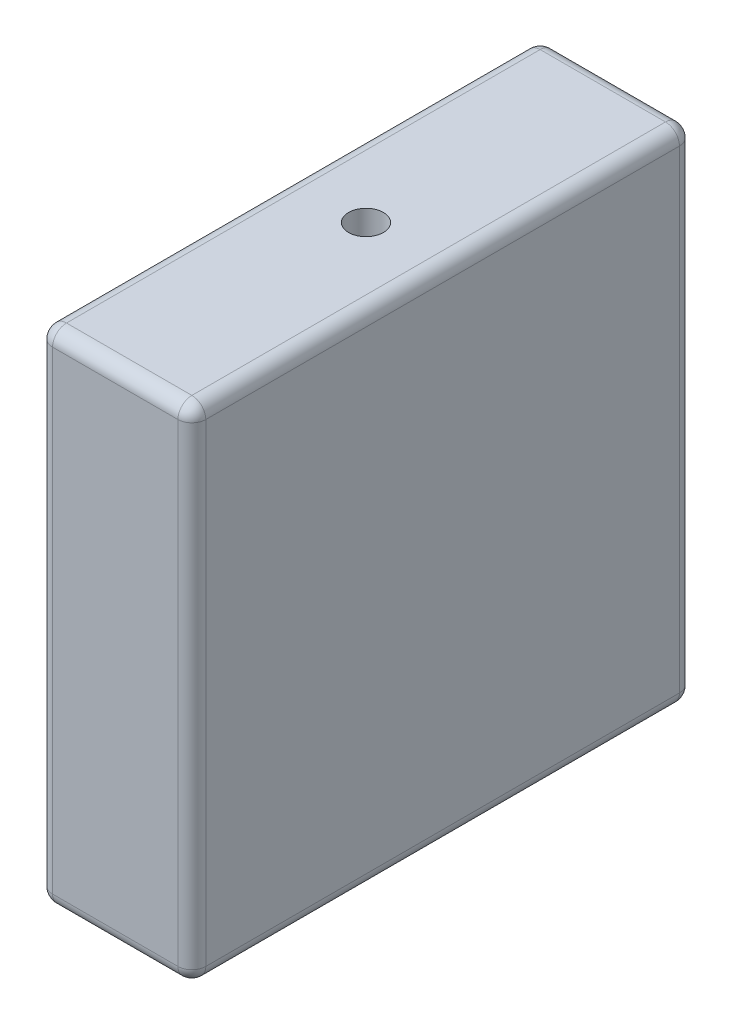
ISO-10303-21;
HEADER;
FILE_DESCRIPTION(('STEP AP214'),'2;1');
FILE_NAME('part.step','',(''),(''),'','','');
FILE_SCHEMA(('AUTOMOTIVE_DESIGN { 1 0 10303 214 1 1 1 1 }'));
ENDSEC;
DATA;
#1=APPLICATION_CONTEXT('core data for automotive mechanical design processes');
#2=APPLICATION_PROTOCOL_DEFINITION('international standard','automotive_design',2000,#1);
#3=PRODUCT_CONTEXT('',#1,'mechanical');
#4=PRODUCT('Part','Part','',(#3));
#5=PRODUCT_RELATED_PRODUCT_CATEGORY('part','',(#4));
#6=PRODUCT_DEFINITION_FORMATION('','',#4);
#7=PRODUCT_DEFINITION_CONTEXT('part definition',#1,'design');
#8=PRODUCT_DEFINITION('design','',#6,#7);
#9=PRODUCT_DEFINITION_SHAPE('','',#8);
#10=(LENGTH_UNIT() NAMED_UNIT(*) SI_UNIT(.MILLI.,.METRE.));
#11=(NAMED_UNIT(*) PLANE_ANGLE_UNIT() SI_UNIT($,.RADIAN.));
#12=(NAMED_UNIT(*) SI_UNIT($,.STERADIAN.) SOLID_ANGLE_UNIT());
#13=UNCERTAINTY_MEASURE_WITH_UNIT(LENGTH_MEASURE(1.E-05),#10,'distance_accuracy_value','');
#14=(GEOMETRIC_REPRESENTATION_CONTEXT(3) GLOBAL_UNCERTAINTY_ASSIGNED_CONTEXT((#13)) GLOBAL_UNIT_ASSIGNED_CONTEXT((#10,
#11,#12)) REPRESENTATION_CONTEXT('',''));
#15=CARTESIAN_POINT('',(0.,0.,0.));
#16=DIRECTION('',(0.,0.,1.));
#17=DIRECTION('',(1.,0.,0.));
#18=AXIS2_PLACEMENT_3D('',#15,#16,#17);
#19=CARTESIAN_POINT('',(11.,27.3964350537823,30.7352782576782));
#20=DIRECTION('',(0.,0.,-1.));
#21=DIRECTION('',(-1.,0.,0.));
#22=AXIS2_PLACEMENT_3D('',#19,#20,#21);
#23=PLANE('',#22);
#24=DIRECTION('',(-1.,0.,0.));
#25=VECTOR('',#24,1.);
#26=CARTESIAN_POINT('',(11.,26.3964350537823,30.7352782576782));
#27=LINE('',#26,#25);
#28=CARTESIAN_POINT('',(10.,26.3964350537823,30.7352782576782));
#29=VERTEX_POINT('',#28);
#30=CARTESIAN_POINT('',(1.,26.3964350537823,30.7352782576782));
#31=VERTEX_POINT('',#30);
#32=EDGE_CURVE('E224',#29,#31,#27,.T.);
#33=ORIENTED_EDGE('',*,*,#32,.T.);
#34=DIRECTION('',(0.,-1.,0.));
#35=VECTOR('',#34,1.);
#36=CARTESIAN_POINT('',(1.,27.3964350537823,30.7352782576782));
#37=LINE('',#36,#35);
#38=CARTESIAN_POINT('',(1.,-7.60356494621773,30.7352782576782));
#39=VERTEX_POINT('',#38);
#40=EDGE_CURVE('E228',#31,#39,#37,.T.);
#41=ORIENTED_EDGE('',*,*,#40,.T.);
#42=DIRECTION('',(-1.,0.,0.));
#43=VECTOR('',#42,1.);
#44=CARTESIAN_POINT('',(11.,-7.60356494621773,30.7352782576782));
#45=LINE('',#44,#43);
#46=CARTESIAN_POINT('',(10.,-7.60356494621773,30.7352782576782));
#47=VERTEX_POINT('',#46);
#48=EDGE_CURVE('E221',#39,#47,#45,.F.);
#49=ORIENTED_EDGE('',*,*,#48,.T.);
#50=DIRECTION('',(0.,-1.,0.));
#51=VECTOR('',#50,1.);
#52=CARTESIAN_POINT('',(10.,27.3964350537823,30.7352782576782));
#53=LINE('',#52,#51);
#54=EDGE_CURVE('E218',#47,#29,#53,.F.);
#55=ORIENTED_EDGE('',*,*,#54,.T.);
#56=EDGE_LOOP('',(#33,#41,#49,#55));
#57=FACE_BOUND('',#56,.T.);
#58=ADVANCED_FACE('F39',(#57),#23,.F.);
#59=CARTESIAN_POINT('',(11.,-8.60356494621773,30.7352782576782));
#60=DIRECTION('',(0.,1.,0.));
#61=DIRECTION('',(0.,0.,1.));
#62=AXIS2_PLACEMENT_3D('',#59,#60,#61);
#63=PLANE('',#62);
#64=CARTESIAN_POINT('',(5.5,-8.60356494621773,12.7352782576782));
#65=DIRECTION('',(0.,-1.,0.));
#66=DIRECTION('',(0.,0.,-1.));
#67=AXIS2_PLACEMENT_3D('',#64,#65,#66);
#68=CIRCLE('',#67,1.25);
#69=CARTESIAN_POINT('',(5.5,-8.60356494621773,11.4852782576782));
#70=VERTEX_POINT('',#69);
#71=EDGE_CURVE('E445',#70,#70,#68,.T.);
#72=ORIENTED_EDGE('',*,*,#71,.F.);
#73=EDGE_LOOP('',(#72));
#74=FACE_BOUND('',#73,.T.);
#75=DIRECTION('',(0.,0.,-1.));
#76=VECTOR('',#75,1.);
#77=CARTESIAN_POINT('',(1.,-8.60356494621773,30.7352782576782));
#78=LINE('',#77,#76);
#79=CARTESIAN_POINT('',(1.,-8.60356494621773,29.7352782576782));
#80=VERTEX_POINT('',#79);
#81=CARTESIAN_POINT('',(1.,-8.60356494621773,-4.26472174232184));
#82=VERTEX_POINT('',#81);
#83=EDGE_CURVE('E187',#80,#82,#78,.T.);
#84=ORIENTED_EDGE('',*,*,#83,.T.);
#85=DIRECTION('',(-1.,0.,0.));
#86=VECTOR('',#85,1.);
#87=CARTESIAN_POINT('',(11.,-8.60356494621773,-4.26472174232183));
#88=LINE('',#87,#86);
#89=CARTESIAN_POINT('',(10.,-8.60356494621773,-4.26472174232184));
#90=VERTEX_POINT('',#89);
#91=EDGE_CURVE('E190',#82,#90,#88,.F.);
#92=ORIENTED_EDGE('',*,*,#91,.T.);
#93=DIRECTION('',(0.,0.,-1.));
#94=VECTOR('',#93,1.);
#95=CARTESIAN_POINT('',(10.,-8.60356494621773,30.7352782576782));
#96=LINE('',#95,#94);
#97=CARTESIAN_POINT('',(10.,-8.60356494621773,29.7352782576782));
#98=VERTEX_POINT('',#97);
#99=EDGE_CURVE('E181',#90,#98,#96,.F.);
#100=ORIENTED_EDGE('',*,*,#99,.T.);
#101=DIRECTION('',(-1.,0.,0.));
#102=VECTOR('',#101,1.);
#103=CARTESIAN_POINT('',(11.,-8.60356494621773,29.7352782576782));
#104=LINE('',#103,#102);
#105=EDGE_CURVE('E184',#98,#80,#104,.T.);
#106=ORIENTED_EDGE('',*,*,#105,.T.);
#107=EDGE_LOOP('',(#84,#92,#100,#106));
#108=FACE_BOUND('',#107,.T.);
#109=ADVANCED_FACE('F363',(#74,#108),#63,.F.);
#110=CARTESIAN_POINT('',(11.,27.3964350537823,-5.26472174232184));
#111=DIRECTION('',(0.,0.,1.));
#112=DIRECTION('',(1.,0.,0.));
#113=AXIS2_PLACEMENT_3D('',#110,#111,#112);
#114=PLANE('',#113);
#115=DIRECTION('',(-1.,0.,0.));
#116=VECTOR('',#115,1.);
#117=CARTESIAN_POINT('',(11.,-7.60356494621773,-5.26472174232184));
#118=LINE('',#117,#116);
#119=CARTESIAN_POINT('',(10.,-7.60356494621773,-5.26472174232184));
#120=VERTEX_POINT('',#119);
#121=CARTESIAN_POINT('',(1.,-7.60356494621773,-5.26472174232184));
#122=VERTEX_POINT('',#121);
#123=EDGE_CURVE('E140',#120,#122,#118,.T.);
#124=ORIENTED_EDGE('',*,*,#123,.T.);
#125=DIRECTION('',(0.,1.,0.));
#126=VECTOR('',#125,1.);
#127=CARTESIAN_POINT('',(1.,27.3964350537823,-5.26472174232184));
#128=LINE('',#127,#126);
#129=CARTESIAN_POINT('',(1.,26.3964350537823,-5.26472174232184));
#130=VERTEX_POINT('',#129);
#131=EDGE_CURVE('E135',#122,#130,#128,.T.);
#132=ORIENTED_EDGE('',*,*,#131,.T.);
#133=DIRECTION('',(-1.,0.,0.));
#134=VECTOR('',#133,1.);
#135=CARTESIAN_POINT('',(11.,26.3964350537823,-5.26472174232184));
#136=LINE('',#135,#134);
#137=CARTESIAN_POINT('',(10.,26.3964350537823,-5.26472174232184));
#138=VERTEX_POINT('',#137);
#139=EDGE_CURVE('E127',#130,#138,#136,.F.);
#140=ORIENTED_EDGE('',*,*,#139,.T.);
#141=DIRECTION('',(0.,1.,0.));
#142=VECTOR('',#141,1.);
#143=CARTESIAN_POINT('',(10.,-8.60356494621773,-5.26472174232184));
#144=LINE('',#143,#142);
#145=EDGE_CURVE('E132',#138,#120,#144,.F.);
#146=ORIENTED_EDGE('',*,*,#145,.T.);
#147=EDGE_LOOP('',(#124,#132,#140,#146));
#148=FACE_BOUND('',#147,.T.);
#149=ADVANCED_FACE('F130',(#148),#114,.F.);
#150=CARTESIAN_POINT('',(11.,27.3964350537823,30.7352782576782));
#151=DIRECTION('',(0.,-1.,0.));
#152=DIRECTION('',(0.,0.,-1.));
#153=AXIS2_PLACEMENT_3D('',#150,#151,#152);
#154=PLANE('',#153);
#155=CARTESIAN_POINT('',(5.5,27.3964350537823,12.7352782576782));
#156=DIRECTION('',(0.,-1.,0.));
#157=DIRECTION('',(0.,0.,-1.));
#158=AXIS2_PLACEMENT_3D('',#155,#156,#157);
#159=CIRCLE('',#158,1.25);
#160=CARTESIAN_POINT('',(5.5,27.3964350537823,11.4852782576782));
#161=VERTEX_POINT('',#160);
#162=EDGE_CURVE('E174',#161,#161,#159,.F.);
#163=ORIENTED_EDGE('',*,*,#162,.F.);
#164=EDGE_LOOP('',(#163));
#165=FACE_BOUND('',#164,.T.);
#166=DIRECTION('',(0.,0.,1.));
#167=VECTOR('',#166,1.);
#168=CARTESIAN_POINT('',(10.,27.3964350537823,-5.26472174232184));
#169=LINE('',#168,#167);
#170=CARTESIAN_POINT('',(10.,27.3964350537823,29.7352782576782));
#171=VERTEX_POINT('',#170);
#172=CARTESIAN_POINT('',(10.,27.3964350537823,-4.26472174232183));
#173=VERTEX_POINT('',#172);
#174=EDGE_CURVE('E194',#171,#173,#169,.F.);
#175=ORIENTED_EDGE('',*,*,#174,.T.);
#176=DIRECTION('',(-1.,0.,0.));
#177=VECTOR('',#176,1.);
#178=CARTESIAN_POINT('',(11.,27.3964350537823,-4.26472174232183));
#179=LINE('',#178,#177);
#180=CARTESIAN_POINT('',(1.,27.3964350537823,-4.26472174232183));
#181=VERTEX_POINT('',#180);
#182=EDGE_CURVE('E148',#173,#181,#179,.T.);
#183=ORIENTED_EDGE('',*,*,#182,.T.);
#184=DIRECTION('',(0.,0.,1.));
#185=VECTOR('',#184,1.);
#186=CARTESIAN_POINT('',(1.,27.3964350537823,30.7352782576782));
#187=LINE('',#186,#185);
#188=CARTESIAN_POINT('',(1.,27.3964350537823,29.7352782576782));
#189=VERTEX_POINT('',#188);
#190=EDGE_CURVE('E200',#181,#189,#187,.T.);
#191=ORIENTED_EDGE('',*,*,#190,.T.);
#192=DIRECTION('',(-1.,0.,0.));
#193=VECTOR('',#192,1.);
#194=CARTESIAN_POINT('',(11.,27.3964350537823,29.7352782576782));
#195=LINE('',#194,#193);
#196=EDGE_CURVE('E197',#189,#171,#195,.F.);
#197=ORIENTED_EDGE('',*,*,#196,.T.);
#198=EDGE_LOOP('',(#175,#183,#191,#197));
#199=FACE_BOUND('',#198,.T.);
#200=ADVANCED_FACE('F353',(#165,#199),#154,.F.);
#201=CARTESIAN_POINT('',(11.,0.,0.));
#202=DIRECTION('',(1.,0.,0.));
#203=DIRECTION('',(0.,0.,-1.));
#204=AXIS2_PLACEMENT_3D('',#201,#202,#203);
#205=PLANE('',#204);
#206=DIRECTION('',(0.,1.,0.));
#207=VECTOR('',#206,1.);
#208=CARTESIAN_POINT('',(11.,27.3964350537823,-4.26472174232184));
#209=LINE('',#208,#207);
#210=CARTESIAN_POINT('',(11.,-7.60356494621773,-4.26472174232184));
#211=VERTEX_POINT('',#210);
#212=CARTESIAN_POINT('',(11.,26.3964350537823,-4.26472174232184));
#213=VERTEX_POINT('',#212);
#214=EDGE_CURVE('E49',#211,#213,#209,.T.);
#215=ORIENTED_EDGE('',*,*,#214,.T.);
#216=DIRECTION('',(0.,0.,1.));
#217=VECTOR('',#216,1.);
#218=CARTESIAN_POINT('',(11.,26.3964350537823,30.7352782576782));
#219=LINE('',#218,#217);
#220=CARTESIAN_POINT('',(11.,26.3964350537823,29.7352782576782));
#221=VERTEX_POINT('',#220);
#222=EDGE_CURVE('E11',#213,#221,#219,.T.);
#223=ORIENTED_EDGE('',*,*,#222,.T.);
#224=DIRECTION('',(0.,-1.,0.));
#225=VECTOR('',#224,1.);
#226=CARTESIAN_POINT('',(11.,-8.60356494621773,29.7352782576782));
#227=LINE('',#226,#225);
#228=CARTESIAN_POINT('',(11.,-7.60356494621773,29.7352782576782));
#229=VERTEX_POINT('',#228);
#230=EDGE_CURVE('E231',#221,#229,#227,.T.);
#231=ORIENTED_EDGE('',*,*,#230,.T.);
#232=DIRECTION('',(0.,0.,-1.));
#233=VECTOR('',#232,1.);
#234=CARTESIAN_POINT('',(11.,-7.60356494621773,-5.26472174232184));
#235=LINE('',#234,#233);
#236=EDGE_CURVE('E60',#229,#211,#235,.T.);
#237=ORIENTED_EDGE('',*,*,#236,.T.);
#238=EDGE_LOOP('',(#215,#223,#231,#237));
#239=FACE_BOUND('',#238,.T.);
#240=ADVANCED_FACE('F355',(#239),#205,.T.);
#241=CARTESIAN_POINT('',(0.,0.,0.));
#242=DIRECTION('',(1.,0.,0.));
#243=DIRECTION('',(0.,0.,-1.));
#244=AXIS2_PLACEMENT_3D('',#241,#242,#243);
#245=PLANE('',#244);
#246=DIRECTION('',(0.,1.,0.));
#247=VECTOR('',#246,1.);
#248=CARTESIAN_POINT('',(0.,0.,-4.26472174232184));
#249=LINE('',#248,#247);
#250=CARTESIAN_POINT('',(0.,26.3964350537823,-4.26472174232184));
#251=VERTEX_POINT('',#250);
#252=CARTESIAN_POINT('',(0.,-7.60356494621773,-4.26472174232184));
#253=VERTEX_POINT('',#252);
#254=EDGE_CURVE('E211',#251,#253,#249,.F.);
#255=ORIENTED_EDGE('',*,*,#254,.T.);
#256=DIRECTION('',(0.,0.,-1.));
#257=VECTOR('',#256,1.);
#258=CARTESIAN_POINT('',(0.,-7.60356494621773,0.));
#259=LINE('',#258,#257);
#260=CARTESIAN_POINT('',(0.,-7.60356494621773,29.7352782576782));
#261=VERTEX_POINT('',#260);
#262=EDGE_CURVE('E214',#253,#261,#259,.F.);
#263=ORIENTED_EDGE('',*,*,#262,.T.);
#264=DIRECTION('',(0.,-1.,0.));
#265=VECTOR('',#264,1.);
#266=CARTESIAN_POINT('',(0.,0.,29.7352782576782));
#267=LINE('',#266,#265);
#268=CARTESIAN_POINT('',(0.,26.3964350537823,29.7352782576782));
#269=VERTEX_POINT('',#268);
#270=EDGE_CURVE('E205',#261,#269,#267,.F.);
#271=ORIENTED_EDGE('',*,*,#270,.T.);
#272=DIRECTION('',(0.,0.,1.));
#273=VECTOR('',#272,1.);
#274=CARTESIAN_POINT('',(0.,26.3964350537823,0.));
#275=LINE('',#274,#273);
#276=EDGE_CURVE('E208',#269,#251,#275,.F.);
#277=ORIENTED_EDGE('',*,*,#276,.T.);
#278=EDGE_LOOP('',(#255,#263,#271,#277));
#279=FACE_BOUND('',#278,.T.);
#280=ADVANCED_FACE('F322',(#279),#245,.F.);
#281=CARTESIAN_POINT('',(11.,26.3964350537823,29.7352782576782));
#282=DIRECTION('',(-1.,0.,0.));
#283=DIRECTION('',(0.,0.,1.));
#284=AXIS2_PLACEMENT_3D('',#281,#282,#283);
#285=CYLINDRICAL_SURFACE('',#284,1.);
#286=CARTESIAN_POINT('',(10.,26.3964350537823,29.7352782576782));
#287=DIRECTION('',(1.,0.,0.));
#288=DIRECTION('',(0.,0.,-1.));
#289=AXIS2_PLACEMENT_3D('',#286,#287,#288);
#290=CIRCLE('',#289,1.);
#291=EDGE_CURVE('E43',#171,#29,#290,.T.);
#292=ORIENTED_EDGE('',*,*,#291,.F.);
#293=ORIENTED_EDGE('',*,*,#196,.F.);
#294=CARTESIAN_POINT('',(1.,26.3964350537823,29.7352782576782));
#295=DIRECTION('',(-1.,0.,0.));
#296=DIRECTION('',(0.,0.,1.));
#297=AXIS2_PLACEMENT_3D('',#294,#295,#296);
#298=CIRCLE('',#297,1.);
#299=EDGE_CURVE('E172',#31,#189,#298,.T.);
#300=ORIENTED_EDGE('',*,*,#299,.F.);
#301=ORIENTED_EDGE('',*,*,#32,.F.);
#302=EDGE_LOOP('',(#292,#293,#300,#301));
#303=FACE_BOUND('',#302,.T.);
#304=ADVANCED_FACE('F41',(#303),#285,.T.);
#305=CARTESIAN_POINT('',(10.,26.3964350537823,29.7352782576782));
#306=DIRECTION('',(0.,0.,1.));
#307=DIRECTION('',(1.,0.,0.));
#308=AXIS2_PLACEMENT_3D('',#305,#306,#307);
#309=SPHERICAL_SURFACE('',#308,1.);
#310=CARTESIAN_POINT('',(10.,26.3964350537823,29.7352782576782));
#311=DIRECTION('',(0.,0.,1.));
#312=DIRECTION('',(1.,0.,0.));
#313=AXIS2_PLACEMENT_3D('',#310,#311,#312);
#314=CIRCLE('',#313,1.);
#315=EDGE_CURVE('E298',#171,#221,#314,.F.);
#316=ORIENTED_EDGE('',*,*,#315,.F.);
#317=ORIENTED_EDGE('',*,*,#291,.T.);
#318=CARTESIAN_POINT('',(10.,26.3964350537823,29.7352782576782));
#319=DIRECTION('',(0.,1.,0.));
#320=DIRECTION('',(0.,0.,1.));
#321=AXIS2_PLACEMENT_3D('',#318,#319,#320);
#322=CIRCLE('',#321,1.);
#323=EDGE_CURVE('E302',#221,#29,#322,.F.);
#324=ORIENTED_EDGE('',*,*,#323,.F.);
#325=EDGE_LOOP('',(#316,#317,#324));
#326=FACE_BOUND('',#325,.T.);
#327=ADVANCED_FACE('F348',(#326),#309,.T.);
#328=CARTESIAN_POINT('',(1.,26.3964350537823,29.7352782576782));
#329=DIRECTION('',(0.,0.,1.));
#330=DIRECTION('',(1.,0.,0.));
#331=AXIS2_PLACEMENT_3D('',#328,#329,#330);
#332=SPHERICAL_SURFACE('',#331,1.);
#333=CARTESIAN_POINT('',(1.,26.3964350537823,29.7352782576782));
#334=DIRECTION('',(0.,1.,0.));
#335=DIRECTION('',(0.,0.,1.));
#336=AXIS2_PLACEMENT_3D('',#333,#334,#335);
#337=CIRCLE('',#336,1.);
#338=EDGE_CURVE('E290',#31,#269,#337,.F.);
#339=ORIENTED_EDGE('',*,*,#338,.F.);
#340=ORIENTED_EDGE('',*,*,#299,.T.);
#341=CARTESIAN_POINT('',(1.,26.3964350537823,29.7352782576782));
#342=DIRECTION('',(0.,0.,1.));
#343=DIRECTION('',(1.,0.,0.));
#344=AXIS2_PLACEMENT_3D('',#341,#342,#343);
#345=CIRCLE('',#344,1.);
#346=EDGE_CURVE('E294',#269,#189,#345,.F.);
#347=ORIENTED_EDGE('',*,*,#346,.F.);
#348=EDGE_LOOP('',(#339,#340,#347));
#349=FACE_BOUND('',#348,.T.);
#350=ADVANCED_FACE('F311',(#349),#332,.T.);
#351=CARTESIAN_POINT('',(10.,0.,29.7352782576782));
#352=DIRECTION('',(0.,1.,0.));
#353=DIRECTION('',(0.,0.,1.));
#354=AXIS2_PLACEMENT_3D('',#351,#352,#353);
#355=CYLINDRICAL_SURFACE('',#354,1.);
#356=ORIENTED_EDGE('',*,*,#323,.T.);
#357=ORIENTED_EDGE('',*,*,#54,.F.);
#358=CARTESIAN_POINT('',(10.,-7.60356494621773,29.7352782576782));
#359=DIRECTION('',(0.,-1.,0.));
#360=DIRECTION('',(0.,0.,-1.));
#361=AXIS2_PLACEMENT_3D('',#358,#359,#360);
#362=CIRCLE('',#361,1.);
#363=EDGE_CURVE('E282',#229,#47,#362,.T.);
#364=ORIENTED_EDGE('',*,*,#363,.F.);
#365=ORIENTED_EDGE('',*,*,#230,.F.);
#366=EDGE_LOOP('',(#356,#357,#364,#365));
#367=FACE_BOUND('',#366,.T.);
#368=ADVANCED_FACE('F343',(#367),#355,.T.);
#369=CARTESIAN_POINT('',(10.,26.3964350537823,0.));
#370=DIRECTION('',(0.,0.,-1.));
#371=DIRECTION('',(-1.,0.,0.));
#372=AXIS2_PLACEMENT_3D('',#369,#370,#371);
#373=CYLINDRICAL_SURFACE('',#372,1.);
#374=ORIENTED_EDGE('',*,*,#315,.T.);
#375=ORIENTED_EDGE('',*,*,#222,.F.);
#376=CARTESIAN_POINT('',(10.,26.3964350537823,-4.26472174232183));
#377=DIRECTION('',(0.,0.,-1.));
#378=DIRECTION('',(-1.,0.,0.));
#379=AXIS2_PLACEMENT_3D('',#376,#377,#378);
#380=CIRCLE('',#379,1.);
#381=EDGE_CURVE('E153',#173,#213,#380,.T.);
#382=ORIENTED_EDGE('',*,*,#381,.F.);
#383=ORIENTED_EDGE('',*,*,#174,.F.);
#384=EDGE_LOOP('',(#374,#375,#382,#383));
#385=FACE_BOUND('',#384,.T.);
#386=ADVANCED_FACE('F351',(#385),#373,.T.);
#387=CARTESIAN_POINT('',(11.,26.3964350537823,-4.26472174232183));
#388=DIRECTION('',(-1.,0.,0.));
#389=DIRECTION('',(0.,0.,1.));
#390=AXIS2_PLACEMENT_3D('',#387,#388,#389);
#391=CYLINDRICAL_SURFACE('',#390,1.);
#392=CARTESIAN_POINT('',(1.,26.3964350537823,-4.26472174232183));
#393=DIRECTION('',(-1.,0.,0.));
#394=DIRECTION('',(0.,0.,1.));
#395=AXIS2_PLACEMENT_3D('',#392,#393,#394);
#396=CIRCLE('',#395,1.);
#397=EDGE_CURVE('E154',#181,#130,#396,.T.);
#398=ORIENTED_EDGE('',*,*,#397,.F.);
#399=ORIENTED_EDGE('',*,*,#182,.F.);
#400=CARTESIAN_POINT('',(10.,26.3964350537823,-4.26472174232184));
#401=DIRECTION('',(1.,0.,0.));
#402=DIRECTION('',(0.,0.,-1.));
#403=AXIS2_PLACEMENT_3D('',#400,#401,#402);
#404=CIRCLE('',#403,1.);
#405=EDGE_CURVE('E144',#138,#173,#404,.T.);
#406=ORIENTED_EDGE('',*,*,#405,.F.);
#407=ORIENTED_EDGE('',*,*,#139,.F.);
#408=EDGE_LOOP('',(#398,#399,#406,#407));
#409=FACE_BOUND('',#408,.T.);
#410=ADVANCED_FACE('F146',(#409),#391,.T.);
#411=CARTESIAN_POINT('',(1.,26.3964350537823,30.7352782576782));
#412=DIRECTION('',(0.,0.,1.));
#413=DIRECTION('',(1.,0.,0.));
#414=AXIS2_PLACEMENT_3D('',#411,#412,#413);
#415=CYLINDRICAL_SURFACE('',#414,1.);
#416=ORIENTED_EDGE('',*,*,#346,.T.);
#417=ORIENTED_EDGE('',*,*,#190,.F.);
#418=CARTESIAN_POINT('',(1.,26.3964350537823,-4.26472174232184));
#419=DIRECTION('',(0.,0.,-1.));
#420=DIRECTION('',(0.,1.,0.));
#421=AXIS2_PLACEMENT_3D('',#418,#419,#420);
#422=CIRCLE('',#421,1.);
#423=EDGE_CURVE('E275',#251,#181,#422,.T.);
#424=ORIENTED_EDGE('',*,*,#423,.F.);
#425=ORIENTED_EDGE('',*,*,#276,.F.);
#426=EDGE_LOOP('',(#416,#417,#424,#425));
#427=FACE_BOUND('',#426,.T.);
#428=ADVANCED_FACE('F318',(#427),#415,.T.);
#429=CARTESIAN_POINT('',(1.,27.3964350537823,29.7352782576782));
#430=DIRECTION('',(0.,-1.,0.));
#431=DIRECTION('',(0.,0.,-1.));
#432=AXIS2_PLACEMENT_3D('',#429,#430,#431);
#433=CYLINDRICAL_SURFACE('',#432,1.);
#434=ORIENTED_EDGE('',*,*,#338,.T.);
#435=ORIENTED_EDGE('',*,*,#270,.F.);
#436=CARTESIAN_POINT('',(1.,-7.60356494621773,29.7352782576782));
#437=DIRECTION('',(0.,-1.,0.));
#438=DIRECTION('',(0.,0.,-1.));
#439=AXIS2_PLACEMENT_3D('',#436,#437,#438);
#440=CIRCLE('',#439,1.);
#441=EDGE_CURVE('E271',#39,#261,#440,.T.);
#442=ORIENTED_EDGE('',*,*,#441,.F.);
#443=ORIENTED_EDGE('',*,*,#40,.F.);
#444=EDGE_LOOP('',(#434,#435,#442,#443));
#445=FACE_BOUND('',#444,.T.);
#446=ADVANCED_FACE('F328',(#445),#433,.T.);
#447=CARTESIAN_POINT('',(11.,-7.60356494621773,29.7352782576782));
#448=DIRECTION('',(-1.,0.,0.));
#449=DIRECTION('',(0.,0.,1.));
#450=AXIS2_PLACEMENT_3D('',#447,#448,#449);
#451=CYLINDRICAL_SURFACE('',#450,1.);
#452=CARTESIAN_POINT('',(10.,-7.60356494621773,29.7352782576782));
#453=DIRECTION('',(1.,0.,0.));
#454=DIRECTION('',(0.,0.,-1.));
#455=AXIS2_PLACEMENT_3D('',#452,#453,#454);
#456=CIRCLE('',#455,1.);
#457=EDGE_CURVE('E286',#47,#98,#456,.T.);
#458=ORIENTED_EDGE('',*,*,#457,.F.);
#459=ORIENTED_EDGE('',*,*,#48,.F.);
#460=CARTESIAN_POINT('',(1.,-7.60356494621773,29.7352782576782));
#461=DIRECTION('',(-1.,0.,0.));
#462=DIRECTION('',(0.,0.,1.));
#463=AXIS2_PLACEMENT_3D('',#460,#461,#462);
#464=CIRCLE('',#463,1.);
#465=EDGE_CURVE('E267',#80,#39,#464,.T.);
#466=ORIENTED_EDGE('',*,*,#465,.F.);
#467=ORIENTED_EDGE('',*,*,#105,.F.);
#468=EDGE_LOOP('',(#458,#459,#466,#467));
#469=FACE_BOUND('',#468,.T.);
#470=ADVANCED_FACE('F335',(#469),#451,.T.);
#471=CARTESIAN_POINT('',(10.,-7.60356494621773,29.7352782576782));
#472=DIRECTION('',(0.,0.,1.));
#473=DIRECTION('',(1.,0.,0.));
#474=AXIS2_PLACEMENT_3D('',#471,#472,#473);
#475=SPHERICAL_SURFACE('',#474,1.);
#476=ORIENTED_EDGE('',*,*,#363,.T.);
#477=ORIENTED_EDGE('',*,*,#457,.T.);
#478=CARTESIAN_POINT('',(10.,-7.60356494621773,29.7352782576782));
#479=DIRECTION('',(0.,0.,1.));
#480=DIRECTION('',(1.,0.,0.));
#481=AXIS2_PLACEMENT_3D('',#478,#479,#480);
#482=CIRCLE('',#481,1.);
#483=EDGE_CURVE('E161',#229,#98,#482,.F.);
#484=ORIENTED_EDGE('',*,*,#483,.F.);
#485=EDGE_LOOP('',(#476,#477,#484));
#486=FACE_BOUND('',#485,.T.);
#487=ADVANCED_FACE('F341',(#486),#475,.T.);
#488=CARTESIAN_POINT('',(10.,26.3964350537823,-4.26472174232184));
#489=DIRECTION('',(0.,0.,1.));
#490=DIRECTION('',(1.,0.,0.));
#491=AXIS2_PLACEMENT_3D('',#488,#489,#490);
#492=SPHERICAL_SURFACE('',#491,1.);
#493=ORIENTED_EDGE('',*,*,#405,.T.);
#494=ORIENTED_EDGE('',*,*,#381,.T.);
#495=CARTESIAN_POINT('',(10.,26.3964350537823,-4.26472174232184));
#496=DIRECTION('',(0.,1.,0.));
#497=DIRECTION('',(0.,0.,1.));
#498=AXIS2_PLACEMENT_3D('',#495,#496,#497);
#499=CIRCLE('',#498,1.);
#500=EDGE_CURVE('E157',#138,#213,#499,.F.);
#501=ORIENTED_EDGE('',*,*,#500,.F.);
#502=EDGE_LOOP('',(#493,#494,#501));
#503=FACE_BOUND('',#502,.T.);
#504=ADVANCED_FACE('F158',(#503),#492,.T.);
#505=CARTESIAN_POINT('',(1.,26.3964350537823,-4.26472174232184));
#506=DIRECTION('',(0.,0.,1.));
#507=DIRECTION('',(1.,0.,0.));
#508=AXIS2_PLACEMENT_3D('',#505,#506,#507);
#509=SPHERICAL_SURFACE('',#508,1.);
#510=ORIENTED_EDGE('',*,*,#423,.T.);
#511=ORIENTED_EDGE('',*,*,#397,.T.);
#512=CARTESIAN_POINT('',(1.,26.3964350537823,-4.26472174232184));
#513=DIRECTION('',(0.,1.,0.));
#514=DIRECTION('',(0.,0.,1.));
#515=AXIS2_PLACEMENT_3D('',#512,#513,#514);
#516=CIRCLE('',#515,1.);
#517=EDGE_CURVE('E162',#251,#130,#516,.F.);
#518=ORIENTED_EDGE('',*,*,#517,.F.);
#519=EDGE_LOOP('',(#510,#511,#518));
#520=FACE_BOUND('',#519,.T.);
#521=ADVANCED_FACE('F405',(#520),#509,.T.);
#522=CARTESIAN_POINT('',(1.,-7.60356494621773,29.7352782576782));
#523=DIRECTION('',(0.,0.,1.));
#524=DIRECTION('',(1.,0.,0.));
#525=AXIS2_PLACEMENT_3D('',#522,#523,#524);
#526=SPHERICAL_SURFACE('',#525,1.);
#527=ORIENTED_EDGE('',*,*,#465,.T.);
#528=ORIENTED_EDGE('',*,*,#441,.T.);
#529=CARTESIAN_POINT('',(1.,-7.60356494621773,29.7352782576782));
#530=DIRECTION('',(0.,0.,1.));
#531=DIRECTION('',(1.,0.,0.));
#532=AXIS2_PLACEMENT_3D('',#529,#530,#531);
#533=CIRCLE('',#532,1.);
#534=EDGE_CURVE('E258',#80,#261,#533,.F.);
#535=ORIENTED_EDGE('',*,*,#534,.F.);
#536=EDGE_LOOP('',(#527,#528,#535));
#537=FACE_BOUND('',#536,.T.);
#538=ADVANCED_FACE('F401',(#537),#526,.T.);
#539=CARTESIAN_POINT('',(10.,-7.60356494621773,0.));
#540=DIRECTION('',(0.,0.,1.));
#541=DIRECTION('',(1.,0.,0.));
#542=AXIS2_PLACEMENT_3D('',#539,#540,#541);
#543=CYLINDRICAL_SURFACE('',#542,1.);
#544=ORIENTED_EDGE('',*,*,#483,.T.);
#545=ORIENTED_EDGE('',*,*,#99,.F.);
#546=CARTESIAN_POINT('',(10.,-7.60356494621773,-4.26472174232184));
#547=DIRECTION('',(0.,0.,-1.));
#548=DIRECTION('',(-1.,0.,0.));
#549=AXIS2_PLACEMENT_3D('',#546,#547,#548);
#550=CIRCLE('',#549,1.);
#551=EDGE_CURVE('E254',#211,#90,#550,.T.);
#552=ORIENTED_EDGE('',*,*,#551,.F.);
#553=ORIENTED_EDGE('',*,*,#236,.F.);
#554=EDGE_LOOP('',(#544,#545,#552,#553));
#555=FACE_BOUND('',#554,.T.);
#556=ADVANCED_FACE('F398',(#555),#543,.T.);
#557=CARTESIAN_POINT('',(10.,0.,-4.26472174232184));
#558=DIRECTION('',(0.,-1.,0.));
#559=DIRECTION('',(0.,0.,-1.));
#560=AXIS2_PLACEMENT_3D('',#557,#558,#559);
#561=CYLINDRICAL_SURFACE('',#560,1.);
#562=ORIENTED_EDGE('',*,*,#500,.T.);
#563=ORIENTED_EDGE('',*,*,#214,.F.);
#564=CARTESIAN_POINT('',(10.,-7.60356494621773,-4.26472174232184));
#565=DIRECTION('',(0.,-1.,0.));
#566=DIRECTION('',(1.,0.,0.));
#567=AXIS2_PLACEMENT_3D('',#564,#565,#566);
#568=CIRCLE('',#567,1.);
#569=EDGE_CURVE('E166',#120,#211,#568,.T.);
#570=ORIENTED_EDGE('',*,*,#569,.F.);
#571=ORIENTED_EDGE('',*,*,#145,.F.);
#572=EDGE_LOOP('',(#562,#563,#570,#571));
#573=FACE_BOUND('',#572,.T.);
#574=ADVANCED_FACE('F164',(#573),#561,.T.);
#575=CARTESIAN_POINT('',(1.,27.3964350537823,-4.26472174232184));
#576=DIRECTION('',(0.,1.,0.));
#577=DIRECTION('',(0.,0.,1.));
#578=AXIS2_PLACEMENT_3D('',#575,#576,#577);
#579=CYLINDRICAL_SURFACE('',#578,1.);
#580=ORIENTED_EDGE('',*,*,#517,.T.);
#581=ORIENTED_EDGE('',*,*,#131,.F.);
#582=CARTESIAN_POINT('',(1.,-7.60356494621773,-4.26472174232184));
#583=DIRECTION('',(0.,-1.,0.));
#584=DIRECTION('',(0.,0.,-1.));
#585=AXIS2_PLACEMENT_3D('',#582,#583,#584);
#586=CIRCLE('',#585,1.);
#587=EDGE_CURVE('E248',#253,#122,#586,.T.);
#588=ORIENTED_EDGE('',*,*,#587,.F.);
#589=ORIENTED_EDGE('',*,*,#254,.F.);
#590=EDGE_LOOP('',(#580,#581,#588,#589));
#591=FACE_BOUND('',#590,.T.);
#592=ADVANCED_FACE('F391',(#591),#579,.T.);
#593=CARTESIAN_POINT('',(1.,-7.60356494621773,30.7352782576782));
#594=DIRECTION('',(0.,0.,-1.));
#595=DIRECTION('',(-1.,0.,0.));
#596=AXIS2_PLACEMENT_3D('',#593,#594,#595);
#597=CYLINDRICAL_SURFACE('',#596,1.);
#598=ORIENTED_EDGE('',*,*,#534,.T.);
#599=ORIENTED_EDGE('',*,*,#262,.F.);
#600=CARTESIAN_POINT('',(1.,-7.60356494621773,-4.26472174232184));
#601=DIRECTION('',(0.,0.,-1.));
#602=DIRECTION('',(-1.,0.,0.));
#603=AXIS2_PLACEMENT_3D('',#600,#601,#602);
#604=CIRCLE('',#603,1.);
#605=EDGE_CURVE('E244',#82,#253,#604,.T.);
#606=ORIENTED_EDGE('',*,*,#605,.F.);
#607=ORIENTED_EDGE('',*,*,#83,.F.);
#608=EDGE_LOOP('',(#598,#599,#606,#607));
#609=FACE_BOUND('',#608,.T.);
#610=ADVANCED_FACE('F387',(#609),#597,.T.);
#611=CARTESIAN_POINT('',(10.,-7.60356494621773,-4.26472174232184));
#612=DIRECTION('',(0.,0.,1.));
#613=DIRECTION('',(1.,0.,0.));
#614=AXIS2_PLACEMENT_3D('',#611,#612,#613);
#615=SPHERICAL_SURFACE('',#614,1.);
#616=ORIENTED_EDGE('',*,*,#569,.T.);
#617=ORIENTED_EDGE('',*,*,#551,.T.);
#618=CARTESIAN_POINT('',(10.,-7.60356494621773,-4.26472174232184));
#619=DIRECTION('',(1.,0.,0.));
#620=DIRECTION('',(0.,0.,-1.));
#621=AXIS2_PLACEMENT_3D('',#618,#619,#620);
#622=CIRCLE('',#621,1.);
#623=EDGE_CURVE('E241',#120,#90,#622,.F.);
#624=ORIENTED_EDGE('',*,*,#623,.F.);
#625=EDGE_LOOP('',(#616,#617,#624));
#626=FACE_BOUND('',#625,.T.);
#627=ADVANCED_FACE('F383',(#626),#615,.T.);
#628=CARTESIAN_POINT('',(1.,-7.60356494621773,-4.26472174232184));
#629=DIRECTION('',(0.,0.,1.));
#630=DIRECTION('',(1.,0.,0.));
#631=AXIS2_PLACEMENT_3D('',#628,#629,#630);
#632=SPHERICAL_SURFACE('',#631,1.);
#633=ORIENTED_EDGE('',*,*,#605,.T.);
#634=ORIENTED_EDGE('',*,*,#587,.T.);
#635=CARTESIAN_POINT('',(1.,-7.60356494621773,-4.26472174232184));
#636=DIRECTION('',(-1.,0.,0.));
#637=DIRECTION('',(0.,0.,1.));
#638=AXIS2_PLACEMENT_3D('',#635,#636,#637);
#639=CIRCLE('',#638,1.);
#640=EDGE_CURVE('E238',#82,#122,#639,.F.);
#641=ORIENTED_EDGE('',*,*,#640,.F.);
#642=EDGE_LOOP('',(#633,#634,#641));
#643=FACE_BOUND('',#642,.T.);
#644=ADVANCED_FACE('F379',(#643),#632,.T.);
#645=CARTESIAN_POINT('',(11.,-7.60356494621773,-4.26472174232184));
#646=DIRECTION('',(-1.,0.,0.));
#647=DIRECTION('',(0.,0.,1.));
#648=AXIS2_PLACEMENT_3D('',#645,#646,#647);
#649=CYLINDRICAL_SURFACE('',#648,1.);
#650=ORIENTED_EDGE('',*,*,#623,.T.);
#651=ORIENTED_EDGE('',*,*,#91,.F.);
#652=ORIENTED_EDGE('',*,*,#640,.T.);
#653=ORIENTED_EDGE('',*,*,#123,.F.);
#654=EDGE_LOOP('',(#650,#651,#652,#653));
#655=FACE_BOUND('',#654,.T.);
#656=ADVANCED_FACE('F375',(#655),#649,.T.);
#657=CARTESIAN_POINT('',(5.5,30.931968959715,12.7352782576782));
#658=DIRECTION('',(0.,-1.,0.));
#659=DIRECTION('',(0.,0.,-1.));
#660=AXIS2_PLACEMENT_3D('',#657,#658,#659);
#661=CYLINDRICAL_SURFACE('',#660,1.25);
#662=ORIENTED_EDGE('',*,*,#162,.T.);
#663=EDGE_LOOP('',(#662));
#664=FACE_BOUND('',#663,.T.);
#665=ORIENTED_EDGE('',*,*,#71,.T.);
#666=EDGE_LOOP('',(#665));
#667=FACE_BOUND('',#666,.T.);
#668=ADVANCED_FACE('F378',(#664,#667),#661,.F.);
#669=CLOSED_SHELL('',(#58,#109,#149,#200,#240,#280,#304,#327,#350,#368,#386,#410,#428,#446,#470,
#487,#504,#521,#538,#556,#574,#592,#610,#627,#644,#656,#668));
#670=MANIFOLD_SOLID_BREP('B2',#669);
#671=ADVANCED_BREP_SHAPE_REPRESENTATION('',(#18,#670),#14);
#672=SHAPE_DEFINITION_REPRESENTATION(#9,#671);
ENDSEC;
END-ISO-10303-21;
